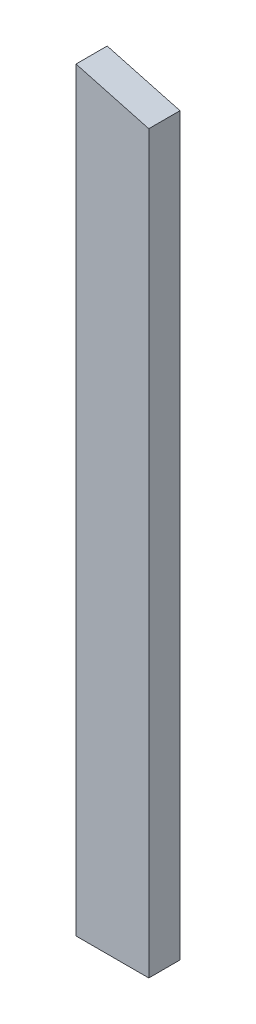
ISO-10303-21;
HEADER;
FILE_DESCRIPTION(('STEP AP214'),'2;1');
FILE_NAME('part.step','',(''),(''),'','','');
FILE_SCHEMA(('AUTOMOTIVE_DESIGN { 1 0 10303 214 1 1 1 1 }'));
ENDSEC;
DATA;
#1=APPLICATION_CONTEXT('core data for automotive mechanical design processes');
#2=APPLICATION_PROTOCOL_DEFINITION('international standard','automotive_design',2000,#1);
#3=PRODUCT_CONTEXT('',#1,'mechanical');
#4=PRODUCT('Part','Part','',(#3));
#5=PRODUCT_RELATED_PRODUCT_CATEGORY('part','',(#4));
#6=PRODUCT_DEFINITION_FORMATION('','',#4);
#7=PRODUCT_DEFINITION_CONTEXT('part definition',#1,'design');
#8=PRODUCT_DEFINITION('design','',#6,#7);
#9=PRODUCT_DEFINITION_SHAPE('','',#8);
#10=(LENGTH_UNIT() NAMED_UNIT(*) SI_UNIT(.MILLI.,.METRE.));
#11=(NAMED_UNIT(*) PLANE_ANGLE_UNIT() SI_UNIT($,.RADIAN.));
#12=(NAMED_UNIT(*) SI_UNIT($,.STERADIAN.) SOLID_ANGLE_UNIT());
#13=UNCERTAINTY_MEASURE_WITH_UNIT(LENGTH_MEASURE(1.E-05),#10,'distance_accuracy_value','');
#14=(GEOMETRIC_REPRESENTATION_CONTEXT(3) GLOBAL_UNCERTAINTY_ASSIGNED_CONTEXT((#13)) GLOBAL_UNIT_ASSIGNED_CONTEXT((#10,
#11,#12)) REPRESENTATION_CONTEXT('',''));
#15=CARTESIAN_POINT('',(0.,0.,0.));
#16=DIRECTION('',(0.,0.,1.));
#17=DIRECTION('',(1.,0.,0.));
#18=AXIS2_PLACEMENT_3D('',#15,#16,#17);
#19=CARTESIAN_POINT('',(0.,34.1967871859219,38.1));
#20=DIRECTION('',(0.,-1.,0.));
#21=DIRECTION('',(1.,0.,0.));
#22=AXIS2_PLACEMENT_3D('',#19,#20,#21);
#23=PLANE('',#22);
#24=DIRECTION('',(-1.,0.,0.));
#25=VECTOR('',#24,1.);
#26=CARTESIAN_POINT('',(0.,34.1967871859219,0.));
#27=LINE('',#26,#25);
#28=CARTESIAN_POINT('',(-641.934498249528,34.1967871859218,0.));
#29=VERTEX_POINT('',#28);
#30=CARTESIAN_POINT('',(-730.834498249528,34.1967871859218,0.));
#31=VERTEX_POINT('',#30);
#32=EDGE_CURVE('E98',#29,#31,#27,.T.);
#33=ORIENTED_EDGE('',*,*,#32,.F.);
#34=DIRECTION('',(0.,0.,-1.));
#35=VECTOR('',#34,1.);
#36=CARTESIAN_POINT('',(-641.934498249528,34.1967871859218,38.1));
#37=LINE('',#36,#35);
#38=CARTESIAN_POINT('',(-641.934498249528,34.1967871859218,38.1));
#39=VERTEX_POINT('',#38);
#40=EDGE_CURVE('E11',#39,#29,#37,.T.);
#41=ORIENTED_EDGE('',*,*,#40,.F.);
#42=DIRECTION('',(-1.,0.,0.));
#43=VECTOR('',#42,1.);
#44=CARTESIAN_POINT('',(0.,34.1967871859219,38.1));
#45=LINE('',#44,#43);
#46=CARTESIAN_POINT('',(-730.834498249528,34.1967871859218,38.1));
#47=VERTEX_POINT('',#46);
#48=EDGE_CURVE('E83',#39,#47,#45,.T.);
#49=ORIENTED_EDGE('',*,*,#48,.T.);
#50=DIRECTION('',(0.,0.,-1.));
#51=VECTOR('',#50,1.);
#52=CARTESIAN_POINT('',(-730.834498249528,34.1967871859218,38.1));
#53=LINE('',#52,#51);
#54=EDGE_CURVE('E51',#47,#31,#53,.T.);
#55=ORIENTED_EDGE('',*,*,#54,.T.);
#56=EDGE_LOOP('',(#33,#41,#49,#55));
#57=FACE_BOUND('',#56,.T.);
#58=ADVANCED_FACE('F35',(#57),#23,.T.);
#59=CARTESIAN_POINT('',(-641.934498249528,0.,38.1));
#60=DIRECTION('',(-1.,0.,0.));
#61=DIRECTION('',(0.,0.,1.));
#62=AXIS2_PLACEMENT_3D('',#59,#60,#61);
#63=PLANE('',#62);
#64=DIRECTION('',(0.,1.,0.));
#65=VECTOR('',#64,1.);
#66=CARTESIAN_POINT('',(-641.934498249528,0.,0.));
#67=LINE('',#66,#65);
#68=CARTESIAN_POINT('',(-641.934498249528,932.719110192997,0.));
#69=VERTEX_POINT('',#68);
#70=EDGE_CURVE('E89',#29,#69,#67,.T.);
#71=ORIENTED_EDGE('',*,*,#70,.T.);
#72=DIRECTION('',(0.,0.,-1.));
#73=VECTOR('',#72,1.);
#74=CARTESIAN_POINT('',(-641.934498249528,932.719110192997,38.1));
#75=LINE('',#74,#73);
#76=CARTESIAN_POINT('',(-641.934498249528,932.719110192997,38.1));
#77=VERTEX_POINT('',#76);
#78=EDGE_CURVE('E43',#77,#69,#75,.T.);
#79=ORIENTED_EDGE('',*,*,#78,.F.);
#80=DIRECTION('',(0.,1.,0.));
#81=VECTOR('',#80,1.);
#82=CARTESIAN_POINT('',(-641.934498249528,0.,38.1));
#83=LINE('',#82,#81);
#84=EDGE_CURVE('E77',#39,#77,#83,.T.);
#85=ORIENTED_EDGE('',*,*,#84,.F.);
#86=ORIENTED_EDGE('',*,*,#40,.T.);
#87=EDGE_LOOP('',(#71,#79,#85,#86));
#88=FACE_BOUND('',#87,.T.);
#89=ADVANCED_FACE('F87',(#88),#63,.F.);
#90=CARTESIAN_POINT('',(190.953718769038,708.120040435182,38.1));
#91=DIRECTION('',(0.260362499760678,0.965510936612513,0.));
#92=DIRECTION('',(-0.965510936612513,0.260362499760678,0.));
#93=AXIS2_PLACEMENT_3D('',#90,#91,#92);
#94=PLANE('',#93);
#95=DIRECTION('',(0.965510936612513,-0.260362499760678,0.));
#96=VECTOR('',#95,1.);
#97=CARTESIAN_POINT('',(190.953718769038,708.120040435182,0.));
#98=LINE('',#97,#96);
#99=CARTESIAN_POINT('',(-730.834498249528,956.692143900862,0.));
#100=VERTEX_POINT('',#99);
#101=EDGE_CURVE('E101',#100,#69,#98,.T.);
#102=ORIENTED_EDGE('',*,*,#101,.F.);
#103=DIRECTION('',(0.,0.,-1.));
#104=VECTOR('',#103,1.);
#105=CARTESIAN_POINT('',(-730.834498249528,956.692143900862,38.1));
#106=LINE('',#105,#104);
#107=CARTESIAN_POINT('',(-730.834498249528,956.692143900862,38.1));
#108=VERTEX_POINT('',#107);
#109=EDGE_CURVE('E64',#108,#100,#106,.T.);
#110=ORIENTED_EDGE('',*,*,#109,.F.);
#111=DIRECTION('',(0.965510936612513,-0.260362499760678,0.));
#112=VECTOR('',#111,1.);
#113=CARTESIAN_POINT('',(190.953718769038,708.120040435182,38.1));
#114=LINE('',#113,#112);
#115=EDGE_CURVE('E82',#108,#77,#114,.T.);
#116=ORIENTED_EDGE('',*,*,#115,.T.);
#117=ORIENTED_EDGE('',*,*,#78,.T.);
#118=EDGE_LOOP('',(#102,#110,#116,#117));
#119=FACE_BOUND('',#118,.T.);
#120=ADVANCED_FACE('F92',(#119),#94,.T.);
#121=CARTESIAN_POINT('',(-730.834498249528,0.,38.1));
#122=DIRECTION('',(-1.,0.,0.));
#123=DIRECTION('',(0.,0.,1.));
#124=AXIS2_PLACEMENT_3D('',#121,#122,#123);
#125=PLANE('',#124);
#126=DIRECTION('',(0.,1.,0.));
#127=VECTOR('',#126,1.);
#128=CARTESIAN_POINT('',(-730.834498249528,0.,0.));
#129=LINE('',#128,#127);
#130=EDGE_CURVE('E103',#31,#100,#129,.T.);
#131=ORIENTED_EDGE('',*,*,#130,.F.);
#132=ORIENTED_EDGE('',*,*,#54,.F.);
#133=DIRECTION('',(0.,1.,0.));
#134=VECTOR('',#133,1.);
#135=CARTESIAN_POINT('',(-730.834498249528,0.,38.1));
#136=LINE('',#135,#134);
#137=EDGE_CURVE('E93',#47,#108,#136,.T.);
#138=ORIENTED_EDGE('',*,*,#137,.T.);
#139=ORIENTED_EDGE('',*,*,#109,.T.);
#140=EDGE_LOOP('',(#131,#132,#138,#139));
#141=FACE_BOUND('',#140,.T.);
#142=ADVANCED_FACE('F108',(#141),#125,.T.);
#143=CARTESIAN_POINT('',(0.,0.,38.1));
#144=DIRECTION('',(0.,0.,1.));
#145=DIRECTION('',(1.,0.,0.));
#146=AXIS2_PLACEMENT_3D('',#143,#144,#145);
#147=PLANE('',#146);
#148=ORIENTED_EDGE('',*,*,#48,.F.);
#149=ORIENTED_EDGE('',*,*,#84,.T.);
#150=ORIENTED_EDGE('',*,*,#115,.F.);
#151=ORIENTED_EDGE('',*,*,#137,.F.);
#152=EDGE_LOOP('',(#148,#149,#150,#151));
#153=FACE_BOUND('',#152,.T.);
#154=ADVANCED_FACE('F79',(#153),#147,.T.);
#155=CARTESIAN_POINT('',(0.,0.,0.));
#156=DIRECTION('',(0.,0.,1.));
#157=DIRECTION('',(1.,0.,0.));
#158=AXIS2_PLACEMENT_3D('',#155,#156,#157);
#159=PLANE('',#158);
#160=ORIENTED_EDGE('',*,*,#32,.T.);
#161=ORIENTED_EDGE('',*,*,#130,.T.);
#162=ORIENTED_EDGE('',*,*,#101,.T.);
#163=ORIENTED_EDGE('',*,*,#70,.F.);
#164=EDGE_LOOP('',(#160,#161,#162,#163));
#165=FACE_BOUND('',#164,.T.);
#166=ADVANCED_FACE('F115',(#165),#159,.F.);
#167=CLOSED_SHELL('',(#58,#89,#120,#142,#154,#166));
#168=MANIFOLD_SOLID_BREP('B2',#167);
#169=ADVANCED_BREP_SHAPE_REPRESENTATION('',(#18,#168),#14);
#170=SHAPE_DEFINITION_REPRESENTATION(#9,#169);
ENDSEC;
END-ISO-10303-21;
